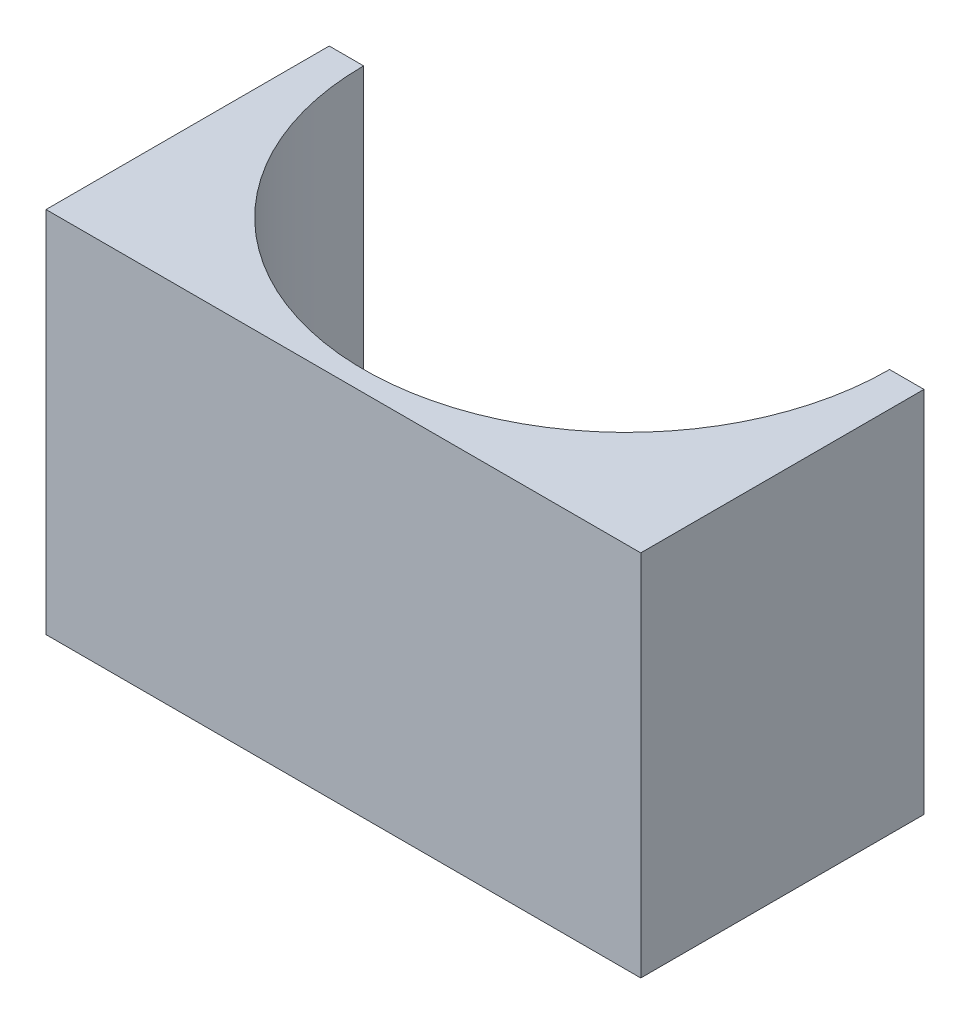
ISO-10303-21;
HEADER;
FILE_DESCRIPTION(('STEP AP214'),'2;1');
FILE_NAME('part.step','',(''),(''),'','','');
FILE_SCHEMA(('AUTOMOTIVE_DESIGN { 1 0 10303 214 1 1 1 1 }'));
ENDSEC;
DATA;
#1=APPLICATION_CONTEXT('core data for automotive mechanical design processes');
#2=APPLICATION_PROTOCOL_DEFINITION('international standard','automotive_design',2000,#1);
#3=PRODUCT_CONTEXT('',#1,'mechanical');
#4=PRODUCT('Part','Part','',(#3));
#5=PRODUCT_RELATED_PRODUCT_CATEGORY('part','',(#4));
#6=PRODUCT_DEFINITION_FORMATION('','',#4);
#7=PRODUCT_DEFINITION_CONTEXT('part definition',#1,'design');
#8=PRODUCT_DEFINITION('design','',#6,#7);
#9=PRODUCT_DEFINITION_SHAPE('','',#8);
#10=(LENGTH_UNIT() NAMED_UNIT(*) SI_UNIT(.MILLI.,.METRE.));
#11=(NAMED_UNIT(*) PLANE_ANGLE_UNIT() SI_UNIT($,.RADIAN.));
#12=(NAMED_UNIT(*) SI_UNIT($,.STERADIAN.) SOLID_ANGLE_UNIT());
#13=UNCERTAINTY_MEASURE_WITH_UNIT(LENGTH_MEASURE(1.E-05),#10,'distance_accuracy_value','');
#14=(GEOMETRIC_REPRESENTATION_CONTEXT(3) GLOBAL_UNCERTAINTY_ASSIGNED_CONTEXT((#13)) GLOBAL_UNIT_ASSIGNED_CONTEXT((#10,
#11,#12)) REPRESENTATION_CONTEXT('',''));
#15=CARTESIAN_POINT('',(0.,0.,0.));
#16=DIRECTION('',(0.,0.,1.));
#17=DIRECTION('',(1.,0.,0.));
#18=AXIS2_PLACEMENT_3D('',#15,#16,#17);
#19=CARTESIAN_POINT('',(-36.75,45.5,-17.5));
#20=DIRECTION('',(0.,0.,-1.));
#21=DIRECTION('',(-1.,0.,0.));
#22=AXIS2_PLACEMENT_3D('',#19,#20,#21);
#23=PLANE('',#22);
#24=DIRECTION('',(0.,1.,0.));
#25=VECTOR('',#24,1.);
#26=CARTESIAN_POINT('',(-32.5,0.,-17.5));
#27=LINE('',#26,#25);
#28=CARTESIAN_POINT('',(-32.5,0.,-17.5));
#29=VERTEX_POINT('',#28);
#30=CARTESIAN_POINT('',(-32.5,45.5,-17.5));
#31=VERTEX_POINT('',#30);
#32=EDGE_CURVE('E106',#29,#31,#27,.T.);
#33=ORIENTED_EDGE('',*,*,#32,.F.);
#34=DIRECTION('',(1.,0.,0.));
#35=VECTOR('',#34,1.);
#36=CARTESIAN_POINT('',(-36.75,0.,-17.5));
#37=LINE('',#36,#35);
#38=CARTESIAN_POINT('',(-36.75,0.,-17.5));
#39=VERTEX_POINT('',#38);
#40=EDGE_CURVE('E114',#39,#29,#37,.T.);
#41=ORIENTED_EDGE('',*,*,#40,.F.);
#42=DIRECTION('',(0.,-1.,0.));
#43=VECTOR('',#42,1.);
#44=CARTESIAN_POINT('',(-36.75,45.5,-17.5));
#45=LINE('',#44,#43);
#46=CARTESIAN_POINT('',(-36.75,45.5,-17.5));
#47=VERTEX_POINT('',#46);
#48=EDGE_CURVE('E134',#47,#39,#45,.T.);
#49=ORIENTED_EDGE('',*,*,#48,.F.);
#50=DIRECTION('',(1.,0.,0.));
#51=VECTOR('',#50,1.);
#52=CARTESIAN_POINT('',(-36.75,45.5,-17.5));
#53=LINE('',#52,#51);
#54=EDGE_CURVE('E115',#47,#31,#53,.T.);
#55=ORIENTED_EDGE('',*,*,#54,.T.);
#56=EDGE_LOOP('',(#33,#41,#49,#55));
#57=FACE_BOUND('',#56,.T.);
#58=ADVANCED_FACE('F45',(#57),#23,.T.);
#59=CARTESIAN_POINT('',(-36.75,45.5,17.5));
#60=DIRECTION('',(0.,0.,-1.));
#61=DIRECTION('',(-1.,0.,0.));
#62=AXIS2_PLACEMENT_3D('',#59,#60,#61);
#63=PLANE('',#62);
#64=DIRECTION('',(1.,0.,0.));
#65=VECTOR('',#64,1.);
#66=CARTESIAN_POINT('',(-36.75,0.,17.5));
#67=LINE('',#66,#65);
#68=CARTESIAN_POINT('',(-36.75,0.,17.5));
#69=VERTEX_POINT('',#68);
#70=CARTESIAN_POINT('',(36.75,0.,17.5));
#71=VERTEX_POINT('',#70);
#72=EDGE_CURVE('E117',#69,#71,#67,.T.);
#73=ORIENTED_EDGE('',*,*,#72,.T.);
#74=DIRECTION('',(0.,-1.,0.));
#75=VECTOR('',#74,1.);
#76=CARTESIAN_POINT('',(36.75,45.5,17.5));
#77=LINE('',#76,#75);
#78=CARTESIAN_POINT('',(36.75,45.5,17.5));
#79=VERTEX_POINT('',#78);
#80=EDGE_CURVE('E54',#79,#71,#77,.T.);
#81=ORIENTED_EDGE('',*,*,#80,.F.);
#82=DIRECTION('',(1.,0.,0.));
#83=VECTOR('',#82,1.);
#84=CARTESIAN_POINT('',(-36.75,45.5,17.5));
#85=LINE('',#84,#83);
#86=CARTESIAN_POINT('',(-36.75,45.5,17.5));
#87=VERTEX_POINT('',#86);
#88=EDGE_CURVE('E95',#87,#79,#85,.T.);
#89=ORIENTED_EDGE('',*,*,#88,.F.);
#90=DIRECTION('',(0.,-1.,0.));
#91=VECTOR('',#90,1.);
#92=CARTESIAN_POINT('',(-36.75,45.5,17.5));
#93=LINE('',#92,#91);
#94=EDGE_CURVE('E131',#87,#69,#93,.T.);
#95=ORIENTED_EDGE('',*,*,#94,.T.);
#96=EDGE_LOOP('',(#73,#81,#89,#95));
#97=FACE_BOUND('',#96,.T.);
#98=ADVANCED_FACE('F47',(#97),#63,.F.);
#99=CARTESIAN_POINT('',(36.75,45.5,-17.5));
#100=DIRECTION('',(1.,0.,0.));
#101=DIRECTION('',(0.,0.,-1.));
#102=AXIS2_PLACEMENT_3D('',#99,#100,#101);
#103=PLANE('',#102);
#104=DIRECTION('',(0.,0.,1.));
#105=VECTOR('',#104,1.);
#106=CARTESIAN_POINT('',(36.75,0.,-17.5));
#107=LINE('',#106,#105);
#108=CARTESIAN_POINT('',(36.75,0.,-17.5));
#109=VERTEX_POINT('',#108);
#110=EDGE_CURVE('E127',#109,#71,#107,.T.);
#111=ORIENTED_EDGE('',*,*,#110,.F.);
#112=DIRECTION('',(0.,-1.,0.));
#113=VECTOR('',#112,1.);
#114=CARTESIAN_POINT('',(36.75,45.5,-17.5));
#115=LINE('',#114,#113);
#116=CARTESIAN_POINT('',(36.75,45.5,-17.5));
#117=VERTEX_POINT('',#116);
#118=EDGE_CURVE('E137',#117,#109,#115,.T.);
#119=ORIENTED_EDGE('',*,*,#118,.F.);
#120=DIRECTION('',(0.,0.,1.));
#121=VECTOR('',#120,1.);
#122=CARTESIAN_POINT('',(36.75,45.5,-17.5));
#123=LINE('',#122,#121);
#124=EDGE_CURVE('E148',#117,#79,#123,.T.);
#125=ORIENTED_EDGE('',*,*,#124,.T.);
#126=ORIENTED_EDGE('',*,*,#80,.T.);
#127=EDGE_LOOP('',(#111,#119,#125,#126));
#128=FACE_BOUND('',#127,.T.);
#129=ADVANCED_FACE('F145',(#128),#103,.T.);
#130=DIRECTION('',(0.,1.,0.));
#131=VECTOR('',#130,1.);
#132=CARTESIAN_POINT('',(32.5,0.,-17.5));
#133=LINE('',#132,#131);
#134=CARTESIAN_POINT('',(32.5,45.5,-17.5));
#135=VERTEX_POINT('',#134);
#136=CARTESIAN_POINT('',(32.5,0.,-17.5));
#137=VERTEX_POINT('',#136);
#138=EDGE_CURVE('E60',#135,#137,#133,.F.);
#139=ORIENTED_EDGE('',*,*,#138,.F.);
#140=EDGE_CURVE('E162',#135,#117,#53,.T.);
#141=ORIENTED_EDGE('',*,*,#140,.T.);
#142=ORIENTED_EDGE('',*,*,#118,.T.);
#143=EDGE_CURVE('E122',#137,#109,#37,.T.);
#144=ORIENTED_EDGE('',*,*,#143,.F.);
#145=EDGE_LOOP('',(#139,#141,#142,#144));
#146=FACE_BOUND('',#145,.T.);
#147=ADVANCED_FACE('F169',(#146),#23,.T.);
#148=CARTESIAN_POINT('',(-36.75,45.5,-17.5));
#149=DIRECTION('',(1.,0.,0.));
#150=DIRECTION('',(0.,0.,-1.));
#151=AXIS2_PLACEMENT_3D('',#148,#149,#150);
#152=PLANE('',#151);
#153=DIRECTION('',(0.,0.,1.));
#154=VECTOR('',#153,1.);
#155=CARTESIAN_POINT('',(-36.75,0.,-17.5));
#156=LINE('',#155,#154);
#157=EDGE_CURVE('E90',#39,#69,#156,.T.);
#158=ORIENTED_EDGE('',*,*,#157,.T.);
#159=ORIENTED_EDGE('',*,*,#94,.F.);
#160=DIRECTION('',(0.,0.,1.));
#161=VECTOR('',#160,1.);
#162=CARTESIAN_POINT('',(-36.75,45.5,-17.5));
#163=LINE('',#162,#161);
#164=EDGE_CURVE('E69',#47,#87,#163,.T.);
#165=ORIENTED_EDGE('',*,*,#164,.F.);
#166=ORIENTED_EDGE('',*,*,#48,.T.);
#167=EDGE_LOOP('',(#158,#159,#165,#166));
#168=FACE_BOUND('',#167,.T.);
#169=ADVANCED_FACE('F172',(#168),#152,.F.);
#170=CARTESIAN_POINT('',(0.,45.5,0.));
#171=DIRECTION('',(0.,-1.,0.));
#172=DIRECTION('',(0.,0.,-1.));
#173=AXIS2_PLACEMENT_3D('',#170,#171,#172);
#174=PLANE('',#173);
#175=ORIENTED_EDGE('',*,*,#140,.F.);
#176=CARTESIAN_POINT('',(0.,45.5,-17.5));
#177=DIRECTION('',(0.,1.,0.));
#178=DIRECTION('',(0.,0.,1.));
#179=AXIS2_PLACEMENT_3D('',#176,#177,#178);
#180=CIRCLE('',#179,32.5);
#181=EDGE_CURVE('E154',#31,#135,#180,.T.);
#182=ORIENTED_EDGE('',*,*,#181,.F.);
#183=ORIENTED_EDGE('',*,*,#54,.F.);
#184=ORIENTED_EDGE('',*,*,#164,.T.);
#185=ORIENTED_EDGE('',*,*,#88,.T.);
#186=ORIENTED_EDGE('',*,*,#124,.F.);
#187=EDGE_LOOP('',(#175,#182,#183,#184,#185,#186));
#188=FACE_BOUND('',#187,.T.);
#189=ADVANCED_FACE('F170',(#188),#174,.F.);
#190=CARTESIAN_POINT('',(0.,0.,0.));
#191=DIRECTION('',(0.,-1.,0.));
#192=DIRECTION('',(0.,0.,-1.));
#193=AXIS2_PLACEMENT_3D('',#190,#191,#192);
#194=PLANE('',#193);
#195=CARTESIAN_POINT('',(0.,0.,-17.5));
#196=DIRECTION('',(0.,-1.,0.));
#197=DIRECTION('',(0.,0.,-1.));
#198=AXIS2_PLACEMENT_3D('',#195,#196,#197);
#199=CIRCLE('',#198,32.5);
#200=EDGE_CURVE('E11',#137,#29,#199,.T.);
#201=ORIENTED_EDGE('',*,*,#200,.F.);
#202=ORIENTED_EDGE('',*,*,#143,.T.);
#203=ORIENTED_EDGE('',*,*,#110,.T.);
#204=ORIENTED_EDGE('',*,*,#72,.F.);
#205=ORIENTED_EDGE('',*,*,#157,.F.);
#206=ORIENTED_EDGE('',*,*,#40,.T.);
#207=EDGE_LOOP('',(#201,#202,#203,#204,#205,#206));
#208=FACE_BOUND('',#207,.T.);
#209=ADVANCED_FACE('F119',(#208),#194,.T.);
#210=CARTESIAN_POINT('',(0.,0.,-17.5));
#211=DIRECTION('',(0.,1.,0.));
#212=DIRECTION('',(0.,0.,1.));
#213=AXIS2_PLACEMENT_3D('',#210,#211,#212);
#214=CYLINDRICAL_SURFACE('',#213,32.5);
#215=ORIENTED_EDGE('',*,*,#32,.T.);
#216=ORIENTED_EDGE('',*,*,#181,.T.);
#217=ORIENTED_EDGE('',*,*,#138,.T.);
#218=ORIENTED_EDGE('',*,*,#200,.T.);
#219=EDGE_LOOP('',(#215,#216,#217,#218));
#220=FACE_BOUND('',#219,.T.);
#221=ADVANCED_FACE('F105',(#220),#214,.F.);
#222=CLOSED_SHELL('',(#58,#98,#129,#147,#169,#189,#209,#221));
#223=MANIFOLD_SOLID_BREP('B2',#222);
#224=ADVANCED_BREP_SHAPE_REPRESENTATION('',(#18,#223),#14);
#225=SHAPE_DEFINITION_REPRESENTATION(#9,#224);
ENDSEC;
END-ISO-10303-21;
